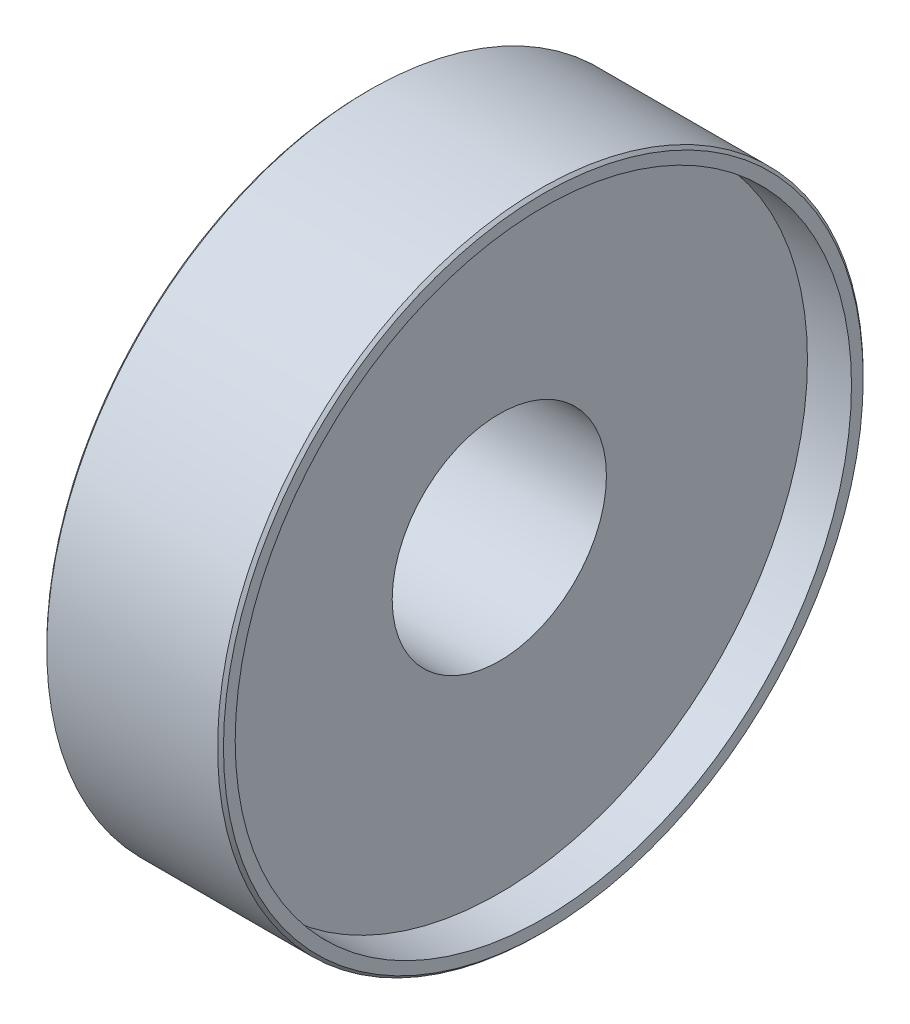
ISO-10303-21;
HEADER;
FILE_DESCRIPTION(('STEP AP214'),'2;1');
FILE_NAME('part.step','',(''),(''),'','','');
FILE_SCHEMA(('AUTOMOTIVE_DESIGN { 1 0 10303 214 1 1 1 1 }'));
ENDSEC;
DATA;
#1=APPLICATION_CONTEXT('core data for automotive mechanical design processes');
#2=APPLICATION_PROTOCOL_DEFINITION('international standard','automotive_design',2000,#1);
#3=PRODUCT_CONTEXT('',#1,'mechanical');
#4=PRODUCT('Part','Part','',(#3));
#5=PRODUCT_RELATED_PRODUCT_CATEGORY('part','',(#4));
#6=PRODUCT_DEFINITION_FORMATION('','',#4);
#7=PRODUCT_DEFINITION_CONTEXT('part definition',#1,'design');
#8=PRODUCT_DEFINITION('design','',#6,#7);
#9=PRODUCT_DEFINITION_SHAPE('','',#8);
#10=(LENGTH_UNIT() NAMED_UNIT(*) SI_UNIT(.MILLI.,.METRE.));
#11=(NAMED_UNIT(*) PLANE_ANGLE_UNIT() SI_UNIT($,.RADIAN.));
#12=(NAMED_UNIT(*) SI_UNIT($,.STERADIAN.) SOLID_ANGLE_UNIT());
#13=UNCERTAINTY_MEASURE_WITH_UNIT(LENGTH_MEASURE(1.E-05),#10,'distance_accuracy_value','');
#14=(GEOMETRIC_REPRESENTATION_CONTEXT(3) GLOBAL_UNCERTAINTY_ASSIGNED_CONTEXT((#13)) GLOBAL_UNIT_ASSIGNED_CONTEXT((#10,
#11,#12)) REPRESENTATION_CONTEXT('',''));
#15=CARTESIAN_POINT('',(0.,0.,0.));
#16=DIRECTION('',(0.,0.,1.));
#17=DIRECTION('',(1.,0.,0.));
#18=AXIS2_PLACEMENT_3D('',#15,#16,#17);
#19=CARTESIAN_POINT('',(50.34,0.,0.));
#20=DIRECTION('',(-1.,0.,0.));
#21=DIRECTION('',(0.,0.,1.));
#22=AXIS2_PLACEMENT_3D('',#19,#20,#21);
#23=CYLINDRICAL_SURFACE('',#22,11.);
#24=CARTESIAN_POINT('',(47.43,0.,0.));
#25=DIRECTION('',(-1.,0.,0.));
#26=DIRECTION('',(0.,0.,1.));
#27=AXIS2_PLACEMENT_3D('',#24,#25,#26);
#28=CIRCLE('',#27,11.);
#29=CARTESIAN_POINT('',(47.43,0.,-11.));
#30=VERTEX_POINT('',#29);
#31=EDGE_CURVE('E125',#30,#30,#28,.T.);
#32=ORIENTED_EDGE('',*,*,#31,.F.);
#33=DIRECTION('',(1.,0.,0.));
#34=VECTOR('',#33,1.);
#35=CARTESIAN_POINT('',(50.34,0.,-11.));
#36=LINE('',#35,#34);
#37=CARTESIAN_POINT('',(53.25,0.,-11.));
#38=VERTEX_POINT('',#37);
#39=EDGE_CURVE('E11',#30,#38,#36,.T.);
#40=ORIENTED_EDGE('',*,*,#39,.T.);
#41=CARTESIAN_POINT('',(53.25,0.,0.));
#42=DIRECTION('',(1.,0.,0.));
#43=DIRECTION('',(0.,0.,1.));
#44=AXIS2_PLACEMENT_3D('',#41,#42,#43);
#45=CIRCLE('',#44,11.);
#46=EDGE_CURVE('E123',#38,#38,#45,.T.);
#47=ORIENTED_EDGE('',*,*,#46,.F.);
#48=ORIENTED_EDGE('',*,*,#39,.F.);
#49=EDGE_LOOP('',(#32,#40,#47,#48));
#50=FACE_BOUND('',#49,.T.);
#51=ADVANCED_FACE('F17',(#50),#23,.T.);
#52=CARTESIAN_POINT('',(53.3,0.,0.));
#53=DIRECTION('',(-1.,0.,0.));
#54=DIRECTION('',(0.,0.,1.));
#55=AXIS2_PLACEMENT_3D('',#52,#53,#54);
#56=CONICAL_SURFACE('',#55,10.95,0.785398163397448);
#57=ORIENTED_EDGE('',*,*,#46,.T.);
#58=DIRECTION('',(0.707106781186548,0.,0.707106781186548));
#59=VECTOR('',#58,1.);
#60=CARTESIAN_POINT('',(53.3,0.,-10.95));
#61=LINE('',#60,#59);
#62=CARTESIAN_POINT('',(53.35,0.,-10.9));
#63=VERTEX_POINT('',#62);
#64=EDGE_CURVE('E28',#38,#63,#61,.T.);
#65=ORIENTED_EDGE('',*,*,#64,.T.);
#66=CARTESIAN_POINT('',(53.35,0.,0.));
#67=DIRECTION('',(1.,0.,0.));
#68=DIRECTION('',(0.,0.,1.));
#69=AXIS2_PLACEMENT_3D('',#66,#67,#68);
#70=CIRCLE('',#69,10.9);
#71=EDGE_CURVE('E119',#63,#63,#70,.T.);
#72=ORIENTED_EDGE('',*,*,#71,.F.);
#73=ORIENTED_EDGE('',*,*,#64,.F.);
#74=EDGE_LOOP('',(#57,#65,#72,#73));
#75=FACE_BOUND('',#74,.T.);
#76=ADVANCED_FACE('F204',(#75),#56,.T.);
#77=CARTESIAN_POINT('',(53.35,0.,10.75));
#78=DIRECTION('',(1.,0.,0.));
#79=DIRECTION('',(0.,1.,0.));
#80=AXIS2_PLACEMENT_3D('',#77,#78,#79);
#81=PLANE('',#80);
#82=CARTESIAN_POINT('',(53.35,0.,0.));
#83=DIRECTION('',(-1.,0.,0.));
#84=DIRECTION('',(0.,0.,-1.));
#85=AXIS2_PLACEMENT_3D('',#82,#83,#84);
#86=CIRCLE('',#85,10.5);
#87=CARTESIAN_POINT('',(53.35,0.,-10.5));
#88=VERTEX_POINT('',#87);
#89=EDGE_CURVE('E139',#88,#88,#86,.T.);
#90=ORIENTED_EDGE('',*,*,#89,.T.);
#91=EDGE_LOOP('',(#90));
#92=FACE_BOUND('',#91,.T.);
#93=ORIENTED_EDGE('',*,*,#71,.T.);
#94=EDGE_LOOP('',(#93));
#95=FACE_BOUND('',#94,.T.);
#96=ADVANCED_FACE('F19',(#92,#95),#81,.T.);
#97=CARTESIAN_POINT('',(52.6,0.,0.));
#98=DIRECTION('',(-1.,0.,0.));
#99=DIRECTION('',(0.,0.,1.));
#100=AXIS2_PLACEMENT_3D('',#97,#98,#99);
#101=CYLINDRICAL_SURFACE('',#100,10.5);
#102=ORIENTED_EDGE('',*,*,#89,.F.);
#103=DIRECTION('',(-1.,0.,0.));
#104=VECTOR('',#103,1.);
#105=CARTESIAN_POINT('',(52.6,0.,-10.5));
#106=LINE('',#105,#104);
#107=CARTESIAN_POINT('',(51.85,0.,-10.5));
#108=VERTEX_POINT('',#107);
#109=EDGE_CURVE('E124',#88,#108,#106,.T.);
#110=ORIENTED_EDGE('',*,*,#109,.T.);
#111=CARTESIAN_POINT('',(51.85,0.,0.));
#112=DIRECTION('',(1.,0.,0.));
#113=DIRECTION('',(0.,0.,1.));
#114=AXIS2_PLACEMENT_3D('',#111,#112,#113);
#115=CIRCLE('',#114,10.5);
#116=EDGE_CURVE('E152',#108,#108,#115,.T.);
#117=ORIENTED_EDGE('',*,*,#116,.F.);
#118=ORIENTED_EDGE('',*,*,#109,.F.);
#119=EDGE_LOOP('',(#102,#110,#117,#118));
#120=FACE_BOUND('',#119,.T.);
#121=ADVANCED_FACE('F240',(#120),#101,.F.);
#122=CARTESIAN_POINT('',(51.85,0.,7.075));
#123=DIRECTION('',(1.,0.,0.));
#124=DIRECTION('',(0.,1.,0.));
#125=AXIS2_PLACEMENT_3D('',#122,#123,#124);
#126=PLANE('',#125);
#127=CARTESIAN_POINT('',(51.85,0.,0.));
#128=DIRECTION('',(-1.,0.,0.));
#129=DIRECTION('',(0.,0.,-1.));
#130=AXIS2_PLACEMENT_3D('',#127,#128,#129);
#131=CIRCLE('',#130,3.65);
#132=CARTESIAN_POINT('',(51.85,0.,-3.65));
#133=VERTEX_POINT('',#132);
#134=EDGE_CURVE('E160',#133,#133,#131,.T.);
#135=ORIENTED_EDGE('',*,*,#134,.T.);
#136=EDGE_LOOP('',(#135));
#137=FACE_BOUND('',#136,.T.);
#138=ORIENTED_EDGE('',*,*,#116,.T.);
#139=EDGE_LOOP('',(#138));
#140=FACE_BOUND('',#139,.T.);
#141=ADVANCED_FACE('F235',(#137,#140),#126,.T.);
#142=CARTESIAN_POINT('',(48.84,0.,0.));
#143=DIRECTION('',(-1.,0.,0.));
#144=DIRECTION('',(0.,0.,1.));
#145=AXIS2_PLACEMENT_3D('',#142,#143,#144);
#146=CYLINDRICAL_SURFACE('',#145,3.65);
#147=ORIENTED_EDGE('',*,*,#134,.F.);
#148=DIRECTION('',(-1.,0.,0.));
#149=VECTOR('',#148,1.);
#150=CARTESIAN_POINT('',(48.84,0.,-3.65));
#151=LINE('',#150,#149);
#152=CARTESIAN_POINT('',(45.83,0.,-3.65));
#153=VERTEX_POINT('',#152);
#154=EDGE_CURVE('E156',#133,#153,#151,.T.);
#155=ORIENTED_EDGE('',*,*,#154,.T.);
#156=CARTESIAN_POINT('',(45.83,0.,0.));
#157=DIRECTION('',(1.,0.,0.));
#158=DIRECTION('',(0.,0.,1.));
#159=AXIS2_PLACEMENT_3D('',#156,#157,#158);
#160=CIRCLE('',#159,3.65);
#161=EDGE_CURVE('E161',#153,#153,#160,.T.);
#162=ORIENTED_EDGE('',*,*,#161,.F.);
#163=ORIENTED_EDGE('',*,*,#154,.F.);
#164=EDGE_LOOP('',(#147,#155,#162,#163));
#165=FACE_BOUND('',#164,.T.);
#166=ADVANCED_FACE('F212',(#165),#146,.F.);
#167=CARTESIAN_POINT('',(45.83,0.,4.075));
#168=DIRECTION('',(-1.,0.,0.));
#169=DIRECTION('',(0.,0.,1.));
#170=AXIS2_PLACEMENT_3D('',#167,#168,#169);
#171=PLANE('',#170);
#172=ORIENTED_EDGE('',*,*,#161,.T.);
#173=EDGE_LOOP('',(#172));
#174=FACE_BOUND('',#173,.T.);
#175=CARTESIAN_POINT('',(45.83,0.,0.));
#176=DIRECTION('',(-1.,0.,0.));
#177=DIRECTION('',(0.,0.,-1.));
#178=AXIS2_PLACEMENT_3D('',#175,#176,#177);
#179=CIRCLE('',#178,4.5);
#180=CARTESIAN_POINT('',(45.83,0.,-4.5));
#181=VERTEX_POINT('',#180);
#182=EDGE_CURVE('E130',#181,#181,#179,.T.);
#183=ORIENTED_EDGE('',*,*,#182,.T.);
#184=EDGE_LOOP('',(#183));
#185=FACE_BOUND('',#184,.T.);
#186=ADVANCED_FACE('F222',(#174,#185),#171,.T.);
#187=CARTESIAN_POINT('',(46.33,0.,0.));
#188=DIRECTION('',(-1.,0.,0.));
#189=DIRECTION('',(0.,0.,1.));
#190=AXIS2_PLACEMENT_3D('',#187,#188,#189);
#191=CYLINDRICAL_SURFACE('',#190,4.5);
#192=ORIENTED_EDGE('',*,*,#182,.F.);
#193=DIRECTION('',(1.,0.,0.));
#194=VECTOR('',#193,1.);
#195=CARTESIAN_POINT('',(46.33,0.,-4.5));
#196=LINE('',#195,#194);
#197=CARTESIAN_POINT('',(46.83,0.,-4.5));
#198=VERTEX_POINT('',#197);
#199=EDGE_CURVE('E133',#181,#198,#196,.T.);
#200=ORIENTED_EDGE('',*,*,#199,.T.);
#201=CARTESIAN_POINT('',(46.83,0.,0.));
#202=DIRECTION('',(1.,0.,0.));
#203=DIRECTION('',(0.,0.,1.));
#204=AXIS2_PLACEMENT_3D('',#201,#202,#203);
#205=CIRCLE('',#204,4.5);
#206=EDGE_CURVE('E134',#198,#198,#205,.T.);
#207=ORIENTED_EDGE('',*,*,#206,.F.);
#208=ORIENTED_EDGE('',*,*,#199,.F.);
#209=EDGE_LOOP('',(#192,#200,#207,#208));
#210=FACE_BOUND('',#209,.T.);
#211=ADVANCED_FACE('F217',(#210),#191,.T.);
#212=CARTESIAN_POINT('',(46.83,0.,5.25));
#213=DIRECTION('',(-1.,0.,0.));
#214=DIRECTION('',(0.,0.,1.));
#215=AXIS2_PLACEMENT_3D('',#212,#213,#214);
#216=PLANE('',#215);
#217=ORIENTED_EDGE('',*,*,#206,.T.);
#218=EDGE_LOOP('',(#217));
#219=FACE_BOUND('',#218,.T.);
#220=CARTESIAN_POINT('',(46.83,0.,0.));
#221=DIRECTION('',(-1.,0.,0.));
#222=DIRECTION('',(0.,0.,-1.));
#223=AXIS2_PLACEMENT_3D('',#220,#221,#222);
#224=CIRCLE('',#223,6.);
#225=CARTESIAN_POINT('',(46.83,0.,-6.));
#226=VERTEX_POINT('',#225);
#227=EDGE_CURVE('E149',#226,#226,#224,.T.);
#228=ORIENTED_EDGE('',*,*,#227,.T.);
#229=EDGE_LOOP('',(#228));
#230=FACE_BOUND('',#229,.T.);
#231=ADVANCED_FACE('F199',(#219,#230),#216,.T.);
#232=CARTESIAN_POINT('',(47.58,0.,0.));
#233=DIRECTION('',(-1.,0.,0.));
#234=DIRECTION('',(0.,0.,1.));
#235=AXIS2_PLACEMENT_3D('',#232,#233,#234);
#236=CYLINDRICAL_SURFACE('',#235,6.);
#237=ORIENTED_EDGE('',*,*,#227,.F.);
#238=DIRECTION('',(1.,0.,0.));
#239=VECTOR('',#238,1.);
#240=CARTESIAN_POINT('',(47.58,0.,-6.));
#241=LINE('',#240,#239);
#242=CARTESIAN_POINT('',(48.33,0.,-6.));
#243=VERTEX_POINT('',#242);
#244=EDGE_CURVE('E171',#226,#243,#241,.T.);
#245=ORIENTED_EDGE('',*,*,#244,.T.);
#246=CARTESIAN_POINT('',(48.33,0.,0.));
#247=DIRECTION('',(1.,0.,0.));
#248=DIRECTION('',(0.,0.,1.));
#249=AXIS2_PLACEMENT_3D('',#246,#247,#248);
#250=CIRCLE('',#249,6.);
#251=EDGE_CURVE('E92',#243,#243,#250,.T.);
#252=ORIENTED_EDGE('',*,*,#251,.F.);
#253=ORIENTED_EDGE('',*,*,#244,.F.);
#254=EDGE_LOOP('',(#237,#245,#252,#253));
#255=FACE_BOUND('',#254,.T.);
#256=ADVANCED_FACE('F186',(#255),#236,.T.);
#257=CARTESIAN_POINT('',(48.33,0.,7.));
#258=DIRECTION('',(-1.,0.,0.));
#259=DIRECTION('',(0.,0.,1.));
#260=AXIS2_PLACEMENT_3D('',#257,#258,#259);
#261=PLANE('',#260);
#262=ORIENTED_EDGE('',*,*,#251,.T.);
#263=EDGE_LOOP('',(#262));
#264=FACE_BOUND('',#263,.T.);
#265=CARTESIAN_POINT('',(48.33,0.,0.));
#266=DIRECTION('',(-1.,0.,0.));
#267=DIRECTION('',(0.,0.,-1.));
#268=AXIS2_PLACEMENT_3D('',#265,#266,#267);
#269=CIRCLE('',#268,8.);
#270=CARTESIAN_POINT('',(48.33,0.,-8.));
#271=VERTEX_POINT('',#270);
#272=EDGE_CURVE('E90',#271,#271,#269,.T.);
#273=ORIENTED_EDGE('',*,*,#272,.T.);
#274=EDGE_LOOP('',(#273));
#275=FACE_BOUND('',#274,.T.);
#276=ADVANCED_FACE('F189',(#264,#275),#261,.T.);
#277=CARTESIAN_POINT('',(48.83,0.,0.));
#278=DIRECTION('',(-1.,0.,0.));
#279=DIRECTION('',(0.,0.,1.));
#280=AXIS2_PLACEMENT_3D('',#277,#278,#279);
#281=CYLINDRICAL_SURFACE('',#280,8.);
#282=ORIENTED_EDGE('',*,*,#272,.F.);
#283=DIRECTION('',(1.,0.,0.));
#284=VECTOR('',#283,1.);
#285=CARTESIAN_POINT('',(48.83,0.,-8.));
#286=LINE('',#285,#284);
#287=CARTESIAN_POINT('',(49.33,0.,-8.));
#288=VERTEX_POINT('',#287);
#289=EDGE_CURVE('E86',#271,#288,#286,.T.);
#290=ORIENTED_EDGE('',*,*,#289,.T.);
#291=CARTESIAN_POINT('',(49.33,0.,0.));
#292=DIRECTION('',(1.,0.,0.));
#293=DIRECTION('',(0.,0.,1.));
#294=AXIS2_PLACEMENT_3D('',#291,#292,#293);
#295=CIRCLE('',#294,8.);
#296=EDGE_CURVE('E21',#288,#288,#295,.T.);
#297=ORIENTED_EDGE('',*,*,#296,.F.);
#298=ORIENTED_EDGE('',*,*,#289,.F.);
#299=EDGE_LOOP('',(#282,#290,#297,#298));
#300=FACE_BOUND('',#299,.T.);
#301=ADVANCED_FACE('F88',(#300),#281,.T.);
#302=CARTESIAN_POINT('',(49.33,0.,9.25));
#303=DIRECTION('',(-1.,0.,0.));
#304=DIRECTION('',(0.,0.,1.));
#305=AXIS2_PLACEMENT_3D('',#302,#303,#304);
#306=PLANE('',#305);
#307=ORIENTED_EDGE('',*,*,#296,.T.);
#308=EDGE_LOOP('',(#307));
#309=FACE_BOUND('',#308,.T.);
#310=CARTESIAN_POINT('',(49.33,0.,0.));
#311=DIRECTION('',(-1.,0.,0.));
#312=DIRECTION('',(0.,0.,-1.));
#313=AXIS2_PLACEMENT_3D('',#310,#311,#312);
#314=CIRCLE('',#313,10.5);
#315=CARTESIAN_POINT('',(49.33,0.,-10.5));
#316=VERTEX_POINT('',#315);
#317=EDGE_CURVE('E105',#316,#316,#314,.T.);
#318=ORIENTED_EDGE('',*,*,#317,.T.);
#319=EDGE_LOOP('',(#318));
#320=FACE_BOUND('',#319,.T.);
#321=ADVANCED_FACE('F95',(#309,#320),#306,.T.);
#322=CARTESIAN_POINT('',(48.33,0.,0.));
#323=DIRECTION('',(-1.,0.,0.));
#324=DIRECTION('',(0.,0.,1.));
#325=AXIS2_PLACEMENT_3D('',#322,#323,#324);
#326=CYLINDRICAL_SURFACE('',#325,10.5);
#327=ORIENTED_EDGE('',*,*,#317,.F.);
#328=DIRECTION('',(-1.,0.,0.));
#329=VECTOR('',#328,1.);
#330=CARTESIAN_POINT('',(48.33,0.,-10.5));
#331=LINE('',#330,#329);
#332=CARTESIAN_POINT('',(47.33,0.,-10.5));
#333=VERTEX_POINT('',#332);
#334=EDGE_CURVE('E98',#316,#333,#331,.T.);
#335=ORIENTED_EDGE('',*,*,#334,.T.);
#336=CARTESIAN_POINT('',(47.33,0.,0.));
#337=DIRECTION('',(1.,0.,0.));
#338=DIRECTION('',(0.,0.,1.));
#339=AXIS2_PLACEMENT_3D('',#336,#337,#338);
#340=CIRCLE('',#339,10.5);
#341=EDGE_CURVE('E115',#333,#333,#340,.T.);
#342=ORIENTED_EDGE('',*,*,#341,.F.);
#343=ORIENTED_EDGE('',*,*,#334,.F.);
#344=EDGE_LOOP('',(#327,#335,#342,#343));
#345=FACE_BOUND('',#344,.T.);
#346=ADVANCED_FACE('F215',(#345),#326,.F.);
#347=CARTESIAN_POINT('',(47.33,0.,10.75));
#348=DIRECTION('',(-1.,0.,0.));
#349=DIRECTION('',(0.,0.,1.));
#350=AXIS2_PLACEMENT_3D('',#347,#348,#349);
#351=PLANE('',#350);
#352=ORIENTED_EDGE('',*,*,#341,.T.);
#353=EDGE_LOOP('',(#352));
#354=FACE_BOUND('',#353,.T.);
#355=CARTESIAN_POINT('',(47.33,0.,0.));
#356=DIRECTION('',(-1.,0.,0.));
#357=DIRECTION('',(0.,0.,-1.));
#358=AXIS2_PLACEMENT_3D('',#355,#356,#357);
#359=CIRCLE('',#358,10.9);
#360=CARTESIAN_POINT('',(47.33,0.,-10.9));
#361=VERTEX_POINT('',#360);
#362=EDGE_CURVE('E140',#361,#361,#359,.T.);
#363=ORIENTED_EDGE('',*,*,#362,.T.);
#364=EDGE_LOOP('',(#363));
#365=FACE_BOUND('',#364,.T.);
#366=ADVANCED_FACE('F267',(#354,#365),#351,.T.);
#367=CARTESIAN_POINT('',(47.38,0.,0.));
#368=DIRECTION('',(1.,0.,0.));
#369=DIRECTION('',(0.,0.,1.));
#370=AXIS2_PLACEMENT_3D('',#367,#368,#369);
#371=CONICAL_SURFACE('',#370,10.95,0.785398163397448);
#372=ORIENTED_EDGE('',*,*,#31,.T.);
#373=DIRECTION('',(-0.707106781186548,0.,0.707106781186548));
#374=VECTOR('',#373,1.);
#375=CARTESIAN_POINT('',(47.38,0.,-10.95));
#376=LINE('',#375,#374);
#377=EDGE_CURVE('E129',#30,#361,#376,.T.);
#378=ORIENTED_EDGE('',*,*,#377,.T.);
#379=ORIENTED_EDGE('',*,*,#362,.F.);
#380=ORIENTED_EDGE('',*,*,#377,.F.);
#381=EDGE_LOOP('',(#372,#378,#379,#380));
#382=FACE_BOUND('',#381,.T.);
#383=ADVANCED_FACE('F265',(#382),#371,.T.);
#384=CLOSED_SHELL('',(#51,#76,#96,#121,#141,#166,#186,#211,#231,#256,#276,#301,#321,#346,#366,#383));
#385=MANIFOLD_SOLID_BREP('B1',#384);
#386=ADVANCED_BREP_SHAPE_REPRESENTATION('',(#18,#385),#14);
#387=SHAPE_DEFINITION_REPRESENTATION(#9,#386);
ENDSEC;
END-ISO-10303-21;
